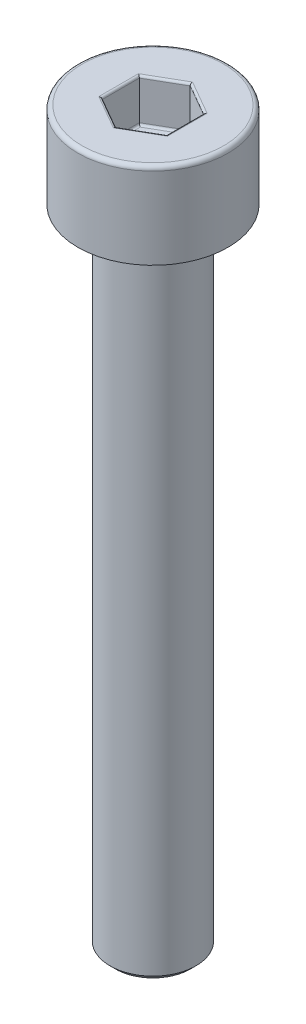
ISO-10303-21;
HEADER;
FILE_DESCRIPTION(('STEP AP214'),'2;1');
FILE_NAME('part.step','',(''),(''),'','','');
FILE_SCHEMA(('AUTOMOTIVE_DESIGN { 1 0 10303 214 1 1 1 1 }'));
ENDSEC;
DATA;
#1=APPLICATION_CONTEXT('core data for automotive mechanical design processes');
#2=APPLICATION_PROTOCOL_DEFINITION('international standard','automotive_design',2000,#1);
#3=PRODUCT_CONTEXT('',#1,'mechanical');
#4=PRODUCT('Part','Part','',(#3));
#5=PRODUCT_RELATED_PRODUCT_CATEGORY('part','',(#4));
#6=PRODUCT_DEFINITION_FORMATION('','',#4);
#7=PRODUCT_DEFINITION_CONTEXT('part definition',#1,'design');
#8=PRODUCT_DEFINITION('design','',#6,#7);
#9=PRODUCT_DEFINITION_SHAPE('','',#8);
#10=(LENGTH_UNIT() NAMED_UNIT(*) SI_UNIT(.MILLI.,.METRE.));
#11=(NAMED_UNIT(*) PLANE_ANGLE_UNIT() SI_UNIT($,.RADIAN.));
#12=(NAMED_UNIT(*) SI_UNIT($,.STERADIAN.) SOLID_ANGLE_UNIT());
#13=UNCERTAINTY_MEASURE_WITH_UNIT(LENGTH_MEASURE(1.E-05),#10,'distance_accuracy_value','');
#14=(GEOMETRIC_REPRESENTATION_CONTEXT(3) GLOBAL_UNCERTAINTY_ASSIGNED_CONTEXT((#13)) GLOBAL_UNIT_ASSIGNED_CONTEXT((#10,
#11,#12)) REPRESENTATION_CONTEXT('',''));
#15=CARTESIAN_POINT('',(0.,0.,0.));
#16=DIRECTION('',(0.,0.,1.));
#17=DIRECTION('',(1.,0.,0.));
#18=AXIS2_PLACEMENT_3D('',#15,#16,#17);
#19=CARTESIAN_POINT('',(0.,-34.,0.));
#20=DIRECTION('',(0.,-1.,0.));
#21=DIRECTION('',(0.,0.,-1.));
#22=AXIS2_PLACEMENT_3D('',#19,#20,#21);
#23=PLANE('',#22);
#24=CARTESIAN_POINT('',(0.,-34.,0.));
#25=DIRECTION('',(0.,-1.,0.));
#26=DIRECTION('',(0.,0.,-1.));
#27=AXIS2_PLACEMENT_3D('',#24,#25,#26);
#28=CIRCLE('',#27,1.74999999999999);
#29=CARTESIAN_POINT('',(0.,-34.,-1.74999999999999));
#30=VERTEX_POINT('',#29);
#31=EDGE_CURVE('E261',#30,#30,#28,.T.);
#32=ORIENTED_EDGE('',*,*,#31,.T.);
#33=EDGE_LOOP('',(#32));
#34=FACE_BOUND('',#33,.T.);
#35=ADVANCED_FACE('F33',(#34),#23,.T.);
#36=CARTESIAN_POINT('',(0.,0.,0.));
#37=DIRECTION('',(0.,1.,0.));
#38=DIRECTION('',(0.,0.,1.));
#39=AXIS2_PLACEMENT_3D('',#36,#37,#38);
#40=CYLINDRICAL_SURFACE('',#39,2.);
#41=CARTESIAN_POINT('',(0.,-4.25,0.));
#42=DIRECTION('',(0.,-1.,0.));
#43=DIRECTION('',(0.,0.,-1.));
#44=AXIS2_PLACEMENT_3D('',#41,#42,#43);
#45=CIRCLE('',#44,2.);
#46=CARTESIAN_POINT('',(0.,-4.25,-2.));
#47=VERTEX_POINT('',#46);
#48=EDGE_CURVE('E258',#47,#47,#45,.T.);
#49=ORIENTED_EDGE('',*,*,#48,.T.);
#50=EDGE_LOOP('',(#49));
#51=FACE_BOUND('',#50,.T.);
#52=CARTESIAN_POINT('',(0.,-33.75,0.));
#53=DIRECTION('',(0.,-1.,0.));
#54=DIRECTION('',(0.,0.,-1.));
#55=AXIS2_PLACEMENT_3D('',#52,#53,#54);
#56=CIRCLE('',#55,2.);
#57=CARTESIAN_POINT('',(0.,-33.75,-2.));
#58=VERTEX_POINT('',#57);
#59=EDGE_CURVE('E255',#58,#58,#56,.F.);
#60=ORIENTED_EDGE('',*,*,#59,.T.);
#61=EDGE_LOOP('',(#60));
#62=FACE_BOUND('',#61,.T.);
#63=ADVANCED_FACE('F287',(#51,#62),#40,.T.);
#64=CARTESIAN_POINT('',(-2.,-4.,0.));
#65=DIRECTION('',(0.,-1.,0.));
#66=DIRECTION('',(0.,0.,-1.));
#67=AXIS2_PLACEMENT_3D('',#64,#65,#66);
#68=PLANE('',#67);
#69=CARTESIAN_POINT('',(0.,-4.,0.));
#70=DIRECTION('',(0.,-1.,0.));
#71=DIRECTION('',(0.,0.,-1.));
#72=AXIS2_PLACEMENT_3D('',#69,#70,#71);
#73=CIRCLE('',#72,2.25);
#74=CARTESIAN_POINT('',(0.,-4.,-2.25));
#75=VERTEX_POINT('',#74);
#76=EDGE_CURVE('E252',#75,#75,#73,.F.);
#77=ORIENTED_EDGE('',*,*,#76,.T.);
#78=EDGE_LOOP('',(#77));
#79=FACE_BOUND('',#78,.T.);
#80=CARTESIAN_POINT('',(0.,-4.,0.));
#81=DIRECTION('',(0.,1.,0.));
#82=DIRECTION('',(0.,0.,1.));
#83=AXIS2_PLACEMENT_3D('',#80,#81,#82);
#84=CIRCLE('',#83,3.5);
#85=CARTESIAN_POINT('',(0.,-4.,3.5));
#86=VERTEX_POINT('',#85);
#87=EDGE_CURVE('E249',#86,#86,#84,.T.);
#88=ORIENTED_EDGE('',*,*,#87,.F.);
#89=EDGE_LOOP('',(#88));
#90=FACE_BOUND('',#89,.T.);
#91=ADVANCED_FACE('F293',(#79,#90),#68,.T.);
#92=CARTESIAN_POINT('',(0.,0.,0.));
#93=DIRECTION('',(0.,1.,0.));
#94=DIRECTION('',(0.,0.,1.));
#95=AXIS2_PLACEMENT_3D('',#92,#93,#94);
#96=CYLINDRICAL_SURFACE('',#95,3.5);
#97=CARTESIAN_POINT('',(0.,-0.2,0.));
#98=DIRECTION('',(0.,1.,0.));
#99=DIRECTION('',(0.,0.,1.));
#100=AXIS2_PLACEMENT_3D('',#97,#98,#99);
#101=CIRCLE('',#100,3.5);
#102=CARTESIAN_POINT('',(0.,-0.2,3.5));
#103=VERTEX_POINT('',#102);
#104=EDGE_CURVE('E159',#103,#103,#101,.F.);
#105=ORIENTED_EDGE('',*,*,#104,.T.);
#106=EDGE_LOOP('',(#105));
#107=FACE_BOUND('',#106,.T.);
#108=ORIENTED_EDGE('',*,*,#87,.T.);
#109=EDGE_LOOP('',(#108));
#110=FACE_BOUND('',#109,.T.);
#111=ADVANCED_FACE('F303',(#107,#110),#96,.T.);
#112=CARTESIAN_POINT('',(-3.5,0.,0.));
#113=DIRECTION('',(0.,1.,0.));
#114=DIRECTION('',(0.,0.,1.));
#115=AXIS2_PLACEMENT_3D('',#112,#113,#114);
#116=PLANE('',#115);
#117=DIRECTION('',(0.,0.,1.));
#118=VECTOR('',#117,1.);
#119=CARTESIAN_POINT('',(-1.6,0.,-0.86602540378444));
#120=LINE('',#119,#118);
#121=CARTESIAN_POINT('',(-1.6,0.,0.923760430703401));
#122=VERTEX_POINT('',#121);
#123=CARTESIAN_POINT('',(-1.6,0.,-0.923760430703403));
#124=VERTEX_POINT('',#123);
#125=EDGE_CURVE('E175',#122,#124,#120,.F.);
#126=ORIENTED_EDGE('',*,*,#125,.T.);
#127=DIRECTION('',(-0.866025403784439,0.,0.5));
#128=VECTOR('',#127,1.);
#129=CARTESIAN_POINT('',(-0.0499999999999999,0.,-1.81865334794732));
#130=LINE('',#129,#128);
#131=CARTESIAN_POINT('',(0.,0.,-1.8475208614068));
#132=VERTEX_POINT('',#131);
#133=EDGE_CURVE('E134',#124,#132,#130,.F.);
#134=ORIENTED_EDGE('',*,*,#133,.T.);
#135=DIRECTION('',(-0.866025403784439,0.,-0.5));
#136=VECTOR('',#135,1.);
#137=CARTESIAN_POINT('',(1.55,0.,-0.952627944162884));
#138=LINE('',#137,#136);
#139=CARTESIAN_POINT('',(1.6,0.,-0.923760430703403));
#140=VERTEX_POINT('',#139);
#141=EDGE_CURVE('E161',#132,#140,#138,.F.);
#142=ORIENTED_EDGE('',*,*,#141,.T.);
#143=DIRECTION('',(0.,0.,-1.));
#144=VECTOR('',#143,1.);
#145=CARTESIAN_POINT('',(1.6,0.,0.866025403784439));
#146=LINE('',#145,#144);
#147=CARTESIAN_POINT('',(1.6,0.,0.923760430703402));
#148=VERTEX_POINT('',#147);
#149=EDGE_CURVE('E169',#140,#148,#146,.F.);
#150=ORIENTED_EDGE('',*,*,#149,.T.);
#151=DIRECTION('',(0.866025403784439,0.,-0.5));
#152=VECTOR('',#151,1.);
#153=CARTESIAN_POINT('',(0.0499999999999988,0.,1.81865334794732));
#154=LINE('',#153,#152);
#155=CARTESIAN_POINT('',(0.,0.,1.8475208614068));
#156=VERTEX_POINT('',#155);
#157=EDGE_CURVE('E171',#148,#156,#154,.F.);
#158=ORIENTED_EDGE('',*,*,#157,.T.);
#159=DIRECTION('',(0.866025403784439,0.,0.5));
#160=VECTOR('',#159,1.);
#161=CARTESIAN_POINT('',(-1.55,0.,0.952627944162882));
#162=LINE('',#161,#160);
#163=EDGE_CURVE('E173',#156,#122,#162,.F.);
#164=ORIENTED_EDGE('',*,*,#163,.T.);
#165=EDGE_LOOP('',(#126,#134,#142,#150,#158,#164));
#166=FACE_BOUND('',#165,.T.);
#167=CARTESIAN_POINT('',(0.,0.,0.));
#168=DIRECTION('',(0.,1.,0.));
#169=DIRECTION('',(0.,0.,1.));
#170=AXIS2_PLACEMENT_3D('',#167,#168,#169);
#171=CIRCLE('',#170,3.3);
#172=CARTESIAN_POINT('',(0.,0.,3.3));
#173=VERTEX_POINT('',#172);
#174=EDGE_CURVE('E164',#173,#173,#171,.T.);
#175=ORIENTED_EDGE('',*,*,#174,.T.);
#176=EDGE_LOOP('',(#175));
#177=FACE_BOUND('',#176,.T.);
#178=ADVANCED_FACE('F266',(#166,#177),#116,.T.);
#179=CARTESIAN_POINT('',(0.,-4.,0.));
#180=DIRECTION('',(0.,1.,0.));
#181=DIRECTION('',(0.,0.,1.));
#182=AXIS2_PLACEMENT_3D('',#179,#180,#181);
#183=CONICAL_SURFACE('',#182,2.25,0.785398163397454);
#184=ORIENTED_EDGE('',*,*,#48,.F.);
#185=EDGE_LOOP('',(#184));
#186=FACE_BOUND('',#185,.T.);
#187=ORIENTED_EDGE('',*,*,#76,.F.);
#188=EDGE_LOOP('',(#187));
#189=FACE_BOUND('',#188,.T.);
#190=ADVANCED_FACE('F281',(#186,#189),#183,.T.);
#191=CARTESIAN_POINT('',(0.,-33.75,0.));
#192=DIRECTION('',(0.,1.,0.));
#193=DIRECTION('',(0.,0.,1.));
#194=AXIS2_PLACEMENT_3D('',#191,#192,#193);
#195=CONICAL_SURFACE('',#194,2.,0.785398163397449);
#196=ORIENTED_EDGE('',*,*,#31,.F.);
#197=EDGE_LOOP('',(#196));
#198=FACE_BOUND('',#197,.T.);
#199=ORIENTED_EDGE('',*,*,#59,.F.);
#200=EDGE_LOOP('',(#199));
#201=FACE_BOUND('',#200,.T.);
#202=ADVANCED_FACE('F271',(#198,#201),#195,.T.);
#203=CARTESIAN_POINT('',(0.,-0.2,0.));
#204=DIRECTION('',(0.,1.,0.));
#205=DIRECTION('',(0.,0.,1.));
#206=AXIS2_PLACEMENT_3D('',#203,#204,#205);
#207=TOROIDAL_SURFACE('',#206,3.3,0.2);
#208=ORIENTED_EDGE('',*,*,#104,.F.);
#209=EDGE_LOOP('',(#208));
#210=FACE_BOUND('',#209,.T.);
#211=ORIENTED_EDGE('',*,*,#174,.F.);
#212=EDGE_LOOP('',(#211));
#213=FACE_BOUND('',#212,.T.);
#214=ADVANCED_FACE('F268',(#210,#213),#207,.T.);
#215=CARTESIAN_POINT('',(1.5,-2.,-0.86602540378444));
#216=DIRECTION('',(0.5,0.,-0.866025403784439));
#217=DIRECTION('',(-0.866025403784439,0.,-0.5));
#218=AXIS2_PLACEMENT_3D('',#215,#216,#217);
#219=PLANE('',#218);
#220=DIRECTION('',(0.,1.,0.));
#221=VECTOR('',#220,1.);
#222=CARTESIAN_POINT('',(1.5,-2.,-0.86602540378444));
#223=LINE('',#222,#221);
#224=CARTESIAN_POINT('',(1.5,-1.9,-0.86602540378444));
#225=VERTEX_POINT('',#224);
#226=CARTESIAN_POINT('',(1.5,-0.1,-0.86602540378444));
#227=VERTEX_POINT('',#226);
#228=EDGE_CURVE('E243',#225,#227,#223,.T.);
#229=ORIENTED_EDGE('',*,*,#228,.T.);
#230=DIRECTION('',(-0.866025403784439,0.,-0.5));
#231=VECTOR('',#230,1.);
#232=CARTESIAN_POINT('',(0.,-0.1,-1.73205080756888));
#233=LINE('',#232,#231);
#234=CARTESIAN_POINT('',(0.,-0.1,-1.73205080756888));
#235=VERTEX_POINT('',#234);
#236=EDGE_CURVE('E195',#227,#235,#233,.T.);
#237=ORIENTED_EDGE('',*,*,#236,.T.);
#238=DIRECTION('',(0.,1.,0.));
#239=VECTOR('',#238,1.);
#240=CARTESIAN_POINT('',(0.,-2.,-1.73205080756888));
#241=LINE('',#240,#239);
#242=CARTESIAN_POINT('',(0.,-1.9,-1.73205080756888));
#243=VERTEX_POINT('',#242);
#244=EDGE_CURVE('E145',#243,#235,#241,.T.);
#245=ORIENTED_EDGE('',*,*,#244,.F.);
#246=DIRECTION('',(-0.866025403784439,0.,-0.5));
#247=VECTOR('',#246,1.);
#248=CARTESIAN_POINT('',(1.5,-1.9,-0.86602540378444));
#249=LINE('',#248,#247);
#250=EDGE_CURVE('E193',#243,#225,#249,.F.);
#251=ORIENTED_EDGE('',*,*,#250,.T.);
#252=EDGE_LOOP('',(#229,#237,#245,#251));
#253=FACE_BOUND('',#252,.T.);
#254=ADVANCED_FACE('F270',(#253),#219,.F.);
#255=CARTESIAN_POINT('',(1.5,-2.,0.866025403784439));
#256=DIRECTION('',(1.,0.,0.));
#257=DIRECTION('',(0.,0.,-1.));
#258=AXIS2_PLACEMENT_3D('',#255,#256,#257);
#259=PLANE('',#258);
#260=DIRECTION('',(0.,1.,0.));
#261=VECTOR('',#260,1.);
#262=CARTESIAN_POINT('',(1.5,-2.,0.866025403784439));
#263=LINE('',#262,#261);
#264=CARTESIAN_POINT('',(1.5,-1.9,0.866025403784439));
#265=VERTEX_POINT('',#264);
#266=CARTESIAN_POINT('',(1.5,-0.1,0.866025403784439));
#267=VERTEX_POINT('',#266);
#268=EDGE_CURVE('E240',#265,#267,#263,.T.);
#269=ORIENTED_EDGE('',*,*,#268,.T.);
#270=DIRECTION('',(0.,0.,-1.));
#271=VECTOR('',#270,1.);
#272=CARTESIAN_POINT('',(1.5,-0.1,-0.86602540378444));
#273=LINE('',#272,#271);
#274=EDGE_CURVE('E191',#267,#227,#273,.T.);
#275=ORIENTED_EDGE('',*,*,#274,.T.);
#276=ORIENTED_EDGE('',*,*,#228,.F.);
#277=DIRECTION('',(0.,0.,-1.));
#278=VECTOR('',#277,1.);
#279=CARTESIAN_POINT('',(1.5,-1.9,0.866025403784439));
#280=LINE('',#279,#278);
#281=EDGE_CURVE('E188',#225,#265,#280,.F.);
#282=ORIENTED_EDGE('',*,*,#281,.T.);
#283=EDGE_LOOP('',(#269,#275,#276,#282));
#284=FACE_BOUND('',#283,.T.);
#285=ADVANCED_FACE('F278',(#284),#259,.F.);
#286=CARTESIAN_POINT('',(0.,-2.,1.73205080756888));
#287=DIRECTION('',(0.5,0.,0.866025403784439));
#288=DIRECTION('',(0.866025403784439,0.,-0.5));
#289=AXIS2_PLACEMENT_3D('',#286,#287,#288);
#290=PLANE('',#289);
#291=DIRECTION('',(0.,1.,0.));
#292=VECTOR('',#291,1.);
#293=CARTESIAN_POINT('',(0.,-2.,1.73205080756888));
#294=LINE('',#293,#292);
#295=CARTESIAN_POINT('',(0.,-1.9,1.73205080756888));
#296=VERTEX_POINT('',#295);
#297=CARTESIAN_POINT('',(0.,-0.1,1.73205080756888));
#298=VERTEX_POINT('',#297);
#299=EDGE_CURVE('E237',#296,#298,#294,.T.);
#300=ORIENTED_EDGE('',*,*,#299,.T.);
#301=DIRECTION('',(0.866025403784439,0.,-0.5));
#302=VECTOR('',#301,1.);
#303=CARTESIAN_POINT('',(1.5,-0.1,0.866025403784439));
#304=LINE('',#303,#302);
#305=EDGE_CURVE('E186',#298,#267,#304,.T.);
#306=ORIENTED_EDGE('',*,*,#305,.T.);
#307=ORIENTED_EDGE('',*,*,#268,.F.);
#308=DIRECTION('',(0.866025403784439,0.,-0.5));
#309=VECTOR('',#308,1.);
#310=CARTESIAN_POINT('',(0.,-1.9,1.73205080756888));
#311=LINE('',#310,#309);
#312=EDGE_CURVE('E184',#265,#296,#311,.F.);
#313=ORIENTED_EDGE('',*,*,#312,.T.);
#314=EDGE_LOOP('',(#300,#306,#307,#313));
#315=FACE_BOUND('',#314,.T.);
#316=ADVANCED_FACE('F327',(#315),#290,.F.);
#317=CARTESIAN_POINT('',(-1.5,-2.,0.866025403784438));
#318=DIRECTION('',(-0.5,0.,0.866025403784439));
#319=DIRECTION('',(0.866025403784439,0.,0.5));
#320=AXIS2_PLACEMENT_3D('',#317,#318,#319);
#321=PLANE('',#320);
#322=DIRECTION('',(0.,1.,0.));
#323=VECTOR('',#322,1.);
#324=CARTESIAN_POINT('',(-1.5,-2.,0.866025403784438));
#325=LINE('',#324,#323);
#326=CARTESIAN_POINT('',(-1.5,-1.9,0.866025403784438));
#327=VERTEX_POINT('',#326);
#328=CARTESIAN_POINT('',(-1.5,-0.1,0.866025403784438));
#329=VERTEX_POINT('',#328);
#330=EDGE_CURVE('E128',#327,#329,#325,.T.);
#331=ORIENTED_EDGE('',*,*,#330,.T.);
#332=DIRECTION('',(0.866025403784439,0.,0.5));
#333=VECTOR('',#332,1.);
#334=CARTESIAN_POINT('',(0.,-0.1,1.73205080756888));
#335=LINE('',#334,#333);
#336=EDGE_CURVE('E182',#329,#298,#335,.T.);
#337=ORIENTED_EDGE('',*,*,#336,.T.);
#338=ORIENTED_EDGE('',*,*,#299,.F.);
#339=DIRECTION('',(0.866025403784439,0.,0.5));
#340=VECTOR('',#339,1.);
#341=CARTESIAN_POINT('',(-1.5,-1.9,0.866025403784438));
#342=LINE('',#341,#340);
#343=EDGE_CURVE('E180',#296,#327,#342,.F.);
#344=ORIENTED_EDGE('',*,*,#343,.T.);
#345=EDGE_LOOP('',(#331,#337,#338,#344));
#346=FACE_BOUND('',#345,.T.);
#347=ADVANCED_FACE('F234',(#346),#321,.F.);
#348=CARTESIAN_POINT('',(-1.5,-2.,-0.86602540378444));
#349=DIRECTION('',(-1.,0.,0.));
#350=DIRECTION('',(0.,0.,1.));
#351=AXIS2_PLACEMENT_3D('',#348,#349,#350);
#352=PLANE('',#351);
#353=DIRECTION('',(0.,1.,0.));
#354=VECTOR('',#353,1.);
#355=CARTESIAN_POINT('',(-1.5,-2.,-0.86602540378444));
#356=LINE('',#355,#354);
#357=CARTESIAN_POINT('',(-1.5,-1.9,-0.86602540378444));
#358=VERTEX_POINT('',#357);
#359=CARTESIAN_POINT('',(-1.5,-0.1,-0.86602540378444));
#360=VERTEX_POINT('',#359);
#361=EDGE_CURVE('E126',#358,#360,#356,.T.);
#362=ORIENTED_EDGE('',*,*,#361,.T.);
#363=DIRECTION('',(0.,0.,1.));
#364=VECTOR('',#363,1.);
#365=CARTESIAN_POINT('',(-1.5,-0.1,0.866025403784438));
#366=LINE('',#365,#364);
#367=EDGE_CURVE('E133',#360,#329,#366,.T.);
#368=ORIENTED_EDGE('',*,*,#367,.T.);
#369=ORIENTED_EDGE('',*,*,#330,.F.);
#370=DIRECTION('',(0.,0.,1.));
#371=VECTOR('',#370,1.);
#372=CARTESIAN_POINT('',(-1.5,-1.9,-0.86602540378444));
#373=LINE('',#372,#371);
#374=EDGE_CURVE('E123',#327,#358,#373,.F.);
#375=ORIENTED_EDGE('',*,*,#374,.T.);
#376=EDGE_LOOP('',(#362,#368,#369,#375));
#377=FACE_BOUND('',#376,.T.);
#378=ADVANCED_FACE('F125',(#377),#352,.F.);
#379=CARTESIAN_POINT('',(0.,-2.,-1.73205080756888));
#380=DIRECTION('',(-0.5,0.,-0.866025403784439));
#381=DIRECTION('',(-0.866025403784439,0.,0.5));
#382=AXIS2_PLACEMENT_3D('',#379,#380,#381);
#383=PLANE('',#382);
#384=ORIENTED_EDGE('',*,*,#244,.T.);
#385=DIRECTION('',(-0.866025403784439,0.,0.5));
#386=VECTOR('',#385,1.);
#387=CARTESIAN_POINT('',(-1.5,-0.1,-0.86602540378444));
#388=LINE('',#387,#386);
#389=EDGE_CURVE('E144',#235,#360,#388,.T.);
#390=ORIENTED_EDGE('',*,*,#389,.T.);
#391=ORIENTED_EDGE('',*,*,#361,.F.);
#392=DIRECTION('',(-0.866025403784439,0.,0.5));
#393=VECTOR('',#392,1.);
#394=CARTESIAN_POINT('',(0.,-1.9,-1.73205080756888));
#395=LINE('',#394,#393);
#396=EDGE_CURVE('E141',#358,#243,#395,.F.);
#397=ORIENTED_EDGE('',*,*,#396,.T.);
#398=EDGE_LOOP('',(#384,#390,#391,#397));
#399=FACE_BOUND('',#398,.T.);
#400=ADVANCED_FACE('F139',(#399),#383,.F.);
#401=CARTESIAN_POINT('',(1.5,-2.,-0.86602540378444));
#402=DIRECTION('',(0.,-1.,0.));
#403=DIRECTION('',(0.,0.,-1.));
#404=AXIS2_PLACEMENT_3D('',#401,#402,#403);
#405=PLANE('',#404);
#406=DIRECTION('',(0.866025403784439,0.,-0.5));
#407=VECTOR('',#406,1.);
#408=CARTESIAN_POINT('',(1.45,-2.,0.779422863405995));
#409=LINE('',#408,#407);
#410=CARTESIAN_POINT('',(0.,-2.,1.61658075373095));
#411=VERTEX_POINT('',#410);
#412=CARTESIAN_POINT('',(1.4,-2.,0.808290376865476));
#413=VERTEX_POINT('',#412);
#414=EDGE_CURVE('E42',#411,#413,#409,.T.);
#415=ORIENTED_EDGE('',*,*,#414,.T.);
#416=DIRECTION('',(0.,0.,-1.));
#417=VECTOR('',#416,1.);
#418=CARTESIAN_POINT('',(1.4,-2.,-0.86602540378444));
#419=LINE('',#418,#417);
#420=CARTESIAN_POINT('',(1.4,-2.,-0.808290376865478));
#421=VERTEX_POINT('',#420);
#422=EDGE_CURVE('E11',#413,#421,#419,.T.);
#423=ORIENTED_EDGE('',*,*,#422,.T.);
#424=DIRECTION('',(-0.866025403784439,0.,-0.5));
#425=VECTOR('',#424,1.);
#426=CARTESIAN_POINT('',(-0.0500000000000001,-2.,-1.64544826719043));
#427=LINE('',#426,#425);
#428=CARTESIAN_POINT('',(0.,-2.,-1.61658075373095));
#429=VERTEX_POINT('',#428);
#430=EDGE_CURVE('E197',#421,#429,#427,.T.);
#431=ORIENTED_EDGE('',*,*,#430,.T.);
#432=DIRECTION('',(-0.866025403784439,0.,0.5));
#433=VECTOR('',#432,1.);
#434=CARTESIAN_POINT('',(-1.45,-2.,-0.779422863405997));
#435=LINE('',#434,#433);
#436=CARTESIAN_POINT('',(-1.4,-2.,-0.808290376865478));
#437=VERTEX_POINT('',#436);
#438=EDGE_CURVE('E199',#429,#437,#435,.T.);
#439=ORIENTED_EDGE('',*,*,#438,.T.);
#440=DIRECTION('',(0.,0.,1.));
#441=VECTOR('',#440,1.);
#442=CARTESIAN_POINT('',(-1.4,-2.,0.866025403784438));
#443=LINE('',#442,#441);
#444=CARTESIAN_POINT('',(-1.4,-2.,0.808290376865476));
#445=VERTEX_POINT('',#444);
#446=EDGE_CURVE('E150',#437,#445,#443,.T.);
#447=ORIENTED_EDGE('',*,*,#446,.T.);
#448=DIRECTION('',(0.866025403784439,0.,0.5));
#449=VECTOR('',#448,1.);
#450=CARTESIAN_POINT('',(0.0499999999999989,-2.,1.64544826719043));
#451=LINE('',#450,#449);
#452=EDGE_CURVE('E53',#445,#411,#451,.T.);
#453=ORIENTED_EDGE('',*,*,#452,.T.);
#454=EDGE_LOOP('',(#415,#423,#431,#439,#447,#453));
#455=FACE_BOUND('',#454,.T.);
#456=ADVANCED_FACE('F322',(#455),#405,.F.);
#457=CARTESIAN_POINT('',(0.0499999999999988,-0.1,1.81865334794732));
#458=DIRECTION('',(-0.866025403784439,0.,0.5));
#459=DIRECTION('',(0.5,0.,0.866025403784439));
#460=AXIS2_PLACEMENT_3D('',#457,#458,#459);
#461=CYLINDRICAL_SURFACE('',#460,0.1);
#462=CARTESIAN_POINT('',(0.,-0.1,1.8475208614068));
#463=DIRECTION('',(-1.,0.,0.));
#464=DIRECTION('',(0.,0.,-1.));
#465=AXIS2_PLACEMENT_3D('',#462,#463,#464);
#466=ELLIPSE('',#465,0.115470053837925,0.1);
#467=EDGE_CURVE('E214',#156,#298,#466,.T.);
#468=ORIENTED_EDGE('',*,*,#467,.F.);
#469=ORIENTED_EDGE('',*,*,#157,.F.);
#470=CARTESIAN_POINT('',(1.6,-0.1,0.923760430703402));
#471=DIRECTION('',(-0.5,0.,0.866025403784439));
#472=DIRECTION('',(-0.866025403784439,0.,-0.5));
#473=AXIS2_PLACEMENT_3D('',#470,#471,#472);
#474=ELLIPSE('',#473,0.115470053837925,0.1);
#475=EDGE_CURVE('E217',#267,#148,#474,.F.);
#476=ORIENTED_EDGE('',*,*,#475,.F.);
#477=ORIENTED_EDGE('',*,*,#305,.F.);
#478=EDGE_LOOP('',(#468,#469,#476,#477));
#479=FACE_BOUND('',#478,.T.);
#480=ADVANCED_FACE('F334',(#479),#461,.T.);
#481=CARTESIAN_POINT('',(1.6,-0.1,0.866025403784439));
#482=DIRECTION('',(0.,0.,1.));
#483=DIRECTION('',(1.,0.,0.));
#484=AXIS2_PLACEMENT_3D('',#481,#482,#483);
#485=CYLINDRICAL_SURFACE('',#484,0.1);
#486=ORIENTED_EDGE('',*,*,#475,.T.);
#487=ORIENTED_EDGE('',*,*,#149,.F.);
#488=CARTESIAN_POINT('',(1.6,-0.1,-0.923760430703402));
#489=DIRECTION('',(0.5,0.,0.866025403784439));
#490=DIRECTION('',(-0.866025403784439,0.,0.5));
#491=AXIS2_PLACEMENT_3D('',#488,#489,#490);
#492=ELLIPSE('',#491,0.115470053837925,0.1);
#493=EDGE_CURVE('E211',#227,#140,#492,.F.);
#494=ORIENTED_EDGE('',*,*,#493,.F.);
#495=ORIENTED_EDGE('',*,*,#274,.F.);
#496=EDGE_LOOP('',(#486,#487,#494,#495));
#497=FACE_BOUND('',#496,.T.);
#498=ADVANCED_FACE('F338',(#497),#485,.T.);
#499=CARTESIAN_POINT('',(-1.55,-0.1,0.952627944162882));
#500=DIRECTION('',(-0.866025403784439,0.,-0.5));
#501=DIRECTION('',(-0.5,0.,0.866025403784439));
#502=AXIS2_PLACEMENT_3D('',#499,#500,#501);
#503=CYLINDRICAL_SURFACE('',#502,0.1);
#504=ORIENTED_EDGE('',*,*,#467,.T.);
#505=ORIENTED_EDGE('',*,*,#336,.F.);
#506=CARTESIAN_POINT('',(-1.6,-0.1,0.923760430703401));
#507=DIRECTION('',(-0.5,0.,-0.866025403784439));
#508=DIRECTION('',(0.866025403784439,0.,-0.5));
#509=AXIS2_PLACEMENT_3D('',#506,#507,#508);
#510=ELLIPSE('',#509,0.115470053837925,0.1);
#511=EDGE_CURVE('E208',#122,#329,#510,.T.);
#512=ORIENTED_EDGE('',*,*,#511,.F.);
#513=ORIENTED_EDGE('',*,*,#163,.F.);
#514=EDGE_LOOP('',(#504,#505,#512,#513));
#515=FACE_BOUND('',#514,.T.);
#516=ADVANCED_FACE('F344',(#515),#503,.T.);
#517=CARTESIAN_POINT('',(1.55,-0.1,-0.952627944162884));
#518=DIRECTION('',(0.866025403784439,0.,0.5));
#519=DIRECTION('',(0.5,0.,-0.866025403784439));
#520=AXIS2_PLACEMENT_3D('',#517,#518,#519);
#521=CYLINDRICAL_SURFACE('',#520,0.1);
#522=ORIENTED_EDGE('',*,*,#493,.T.);
#523=ORIENTED_EDGE('',*,*,#141,.F.);
#524=CARTESIAN_POINT('',(0.,-0.1,-1.8475208614068));
#525=DIRECTION('',(1.,0.,0.));
#526=DIRECTION('',(0.,0.,-1.));
#527=AXIS2_PLACEMENT_3D('',#524,#525,#526);
#528=ELLIPSE('',#527,0.115470053837925,0.1);
#529=EDGE_CURVE('E206',#235,#132,#528,.F.);
#530=ORIENTED_EDGE('',*,*,#529,.F.);
#531=ORIENTED_EDGE('',*,*,#236,.F.);
#532=EDGE_LOOP('',(#522,#523,#530,#531));
#533=FACE_BOUND('',#532,.T.);
#534=ADVANCED_FACE('F374',(#533),#521,.T.);
#535=CARTESIAN_POINT('',(-1.6,-0.1,-0.86602540378444));
#536=DIRECTION('',(0.,0.,-1.));
#537=DIRECTION('',(-1.,0.,0.));
#538=AXIS2_PLACEMENT_3D('',#535,#536,#537);
#539=CYLINDRICAL_SURFACE('',#538,0.1);
#540=ORIENTED_EDGE('',*,*,#511,.T.);
#541=ORIENTED_EDGE('',*,*,#367,.F.);
#542=CARTESIAN_POINT('',(-1.6,-0.1,-0.923760430703403));
#543=DIRECTION('',(0.5,0.,-0.866025403784439));
#544=DIRECTION('',(0.866025403784439,0.,0.5));
#545=AXIS2_PLACEMENT_3D('',#542,#543,#544);
#546=ELLIPSE('',#545,0.115470053837925,0.1);
#547=EDGE_CURVE('E204',#124,#360,#546,.T.);
#548=ORIENTED_EDGE('',*,*,#547,.F.);
#549=ORIENTED_EDGE('',*,*,#125,.F.);
#550=EDGE_LOOP('',(#540,#541,#548,#549));
#551=FACE_BOUND('',#550,.T.);
#552=ADVANCED_FACE('F369',(#551),#539,.T.);
#553=CARTESIAN_POINT('',(-0.05,-0.1,-1.81865334794732));
#554=DIRECTION('',(0.866025403784439,0.,-0.5));
#555=DIRECTION('',(-0.5,0.,-0.866025403784439));
#556=AXIS2_PLACEMENT_3D('',#553,#554,#555);
#557=CYLINDRICAL_SURFACE('',#556,0.1);
#558=ORIENTED_EDGE('',*,*,#529,.T.);
#559=ORIENTED_EDGE('',*,*,#133,.F.);
#560=ORIENTED_EDGE('',*,*,#547,.T.);
#561=ORIENTED_EDGE('',*,*,#389,.F.);
#562=EDGE_LOOP('',(#558,#559,#560,#561));
#563=FACE_BOUND('',#562,.T.);
#564=ADVANCED_FACE('F365',(#563),#557,.T.);
#565=CARTESIAN_POINT('',(-1.4,-1.9,-0.86602540378444));
#566=DIRECTION('',(0.,0.,-1.));
#567=DIRECTION('',(-1.,0.,0.));
#568=AXIS2_PLACEMENT_3D('',#565,#566,#567);
#569=CYLINDRICAL_SURFACE('',#568,0.1);
#570=CARTESIAN_POINT('',(-1.4,-1.9,-0.808290376865478));
#571=DIRECTION('',(0.5,0.,-0.866025403784439));
#572=DIRECTION('',(-0.866025403784439,0.,-0.5));
#573=AXIS2_PLACEMENT_3D('',#570,#571,#572);
#574=ELLIPSE('',#573,0.115470053837925,0.1);
#575=EDGE_CURVE('E149',#358,#437,#574,.F.);
#576=ORIENTED_EDGE('',*,*,#575,.F.);
#577=ORIENTED_EDGE('',*,*,#374,.F.);
#578=CARTESIAN_POINT('',(-1.4,-1.9,0.808290376865476));
#579=DIRECTION('',(-0.5,0.,-0.866025403784439));
#580=DIRECTION('',(-0.866025403784439,0.,0.5));
#581=AXIS2_PLACEMENT_3D('',#578,#579,#580);
#582=ELLIPSE('',#581,0.115470053837925,0.1);
#583=EDGE_CURVE('E37',#445,#327,#582,.T.);
#584=ORIENTED_EDGE('',*,*,#583,.F.);
#585=ORIENTED_EDGE('',*,*,#446,.F.);
#586=EDGE_LOOP('',(#576,#577,#584,#585));
#587=FACE_BOUND('',#586,.T.);
#588=ADVANCED_FACE('F35',(#587),#569,.F.);
#589=CARTESIAN_POINT('',(0.0499999999999984,-1.9,1.64544826719043));
#590=DIRECTION('',(-0.866025403784439,0.,-0.5));
#591=DIRECTION('',(-0.5,0.,0.866025403784439));
#592=AXIS2_PLACEMENT_3D('',#589,#590,#591);
#593=CYLINDRICAL_SURFACE('',#592,0.1);
#594=ORIENTED_EDGE('',*,*,#583,.T.);
#595=ORIENTED_EDGE('',*,*,#343,.F.);
#596=CARTESIAN_POINT('',(0.,-1.9,1.61658075373095));
#597=DIRECTION('',(-1.,0.,0.));
#598=DIRECTION('',(0.,0.,1.));
#599=AXIS2_PLACEMENT_3D('',#596,#597,#598);
#600=ELLIPSE('',#599,0.115470053837925,0.1);
#601=EDGE_CURVE('E153',#411,#296,#600,.T.);
#602=ORIENTED_EDGE('',*,*,#601,.F.);
#603=ORIENTED_EDGE('',*,*,#452,.F.);
#604=EDGE_LOOP('',(#594,#595,#602,#603));
#605=FACE_BOUND('',#604,.T.);
#606=ADVANCED_FACE('F231',(#605),#593,.F.);
#607=CARTESIAN_POINT('',(0.8,-1.9,-2.07846096908265));
#608=DIRECTION('',(0.866025403784439,0.,-0.5));
#609=DIRECTION('',(-0.5,0.,-0.866025403784439));
#610=AXIS2_PLACEMENT_3D('',#607,#608,#609);
#611=CYLINDRICAL_SURFACE('',#610,0.1);
#612=ORIENTED_EDGE('',*,*,#575,.T.);
#613=ORIENTED_EDGE('',*,*,#438,.F.);
#614=CARTESIAN_POINT('',(0.,-1.9,-1.61658075373095));
#615=DIRECTION('',(1.,0.,0.));
#616=DIRECTION('',(0.,0.,-1.));
#617=AXIS2_PLACEMENT_3D('',#614,#615,#616);
#618=ELLIPSE('',#617,0.115470053837925,0.1);
#619=EDGE_CURVE('E157',#243,#429,#618,.F.);
#620=ORIENTED_EDGE('',*,*,#619,.F.);
#621=ORIENTED_EDGE('',*,*,#396,.F.);
#622=EDGE_LOOP('',(#612,#613,#620,#621));
#623=FACE_BOUND('',#622,.T.);
#624=ADVANCED_FACE('F155',(#623),#611,.F.);
#625=CARTESIAN_POINT('',(2.2,-1.9,0.346410161513775));
#626=DIRECTION('',(-0.866025403784439,0.,0.5));
#627=DIRECTION('',(0.5,0.,0.866025403784439));
#628=AXIS2_PLACEMENT_3D('',#625,#626,#627);
#629=CYLINDRICAL_SURFACE('',#628,0.1);
#630=ORIENTED_EDGE('',*,*,#601,.T.);
#631=ORIENTED_EDGE('',*,*,#312,.F.);
#632=CARTESIAN_POINT('',(1.4,-1.9,0.808290376865476));
#633=DIRECTION('',(-0.5,0.,0.866025403784439));
#634=DIRECTION('',(0.866025403784439,0.,0.5));
#635=AXIS2_PLACEMENT_3D('',#632,#633,#634);
#636=ELLIPSE('',#635,0.115470053837925,0.1);
#637=EDGE_CURVE('E222',#413,#265,#636,.T.);
#638=ORIENTED_EDGE('',*,*,#637,.F.);
#639=ORIENTED_EDGE('',*,*,#414,.F.);
#640=EDGE_LOOP('',(#630,#631,#638,#639));
#641=FACE_BOUND('',#640,.T.);
#642=ADVANCED_FACE('F228',(#641),#629,.F.);
#643=CARTESIAN_POINT('',(1.45,-1.9,-0.779422863405997));
#644=DIRECTION('',(0.866025403784439,0.,0.5));
#645=DIRECTION('',(0.5,0.,-0.866025403784439));
#646=AXIS2_PLACEMENT_3D('',#643,#644,#645);
#647=CYLINDRICAL_SURFACE('',#646,0.1);
#648=ORIENTED_EDGE('',*,*,#619,.T.);
#649=ORIENTED_EDGE('',*,*,#430,.F.);
#650=CARTESIAN_POINT('',(1.4,-1.9,-0.808290376865478));
#651=DIRECTION('',(0.5,0.,0.866025403784439));
#652=DIRECTION('',(-0.866025403784439,0.,0.5));
#653=AXIS2_PLACEMENT_3D('',#650,#651,#652);
#654=ELLIPSE('',#653,0.115470053837925,0.1);
#655=EDGE_CURVE('E220',#225,#421,#654,.F.);
#656=ORIENTED_EDGE('',*,*,#655,.F.);
#657=ORIENTED_EDGE('',*,*,#250,.F.);
#658=EDGE_LOOP('',(#648,#649,#656,#657));
#659=FACE_BOUND('',#658,.T.);
#660=ADVANCED_FACE('F353',(#659),#647,.F.);
#661=CARTESIAN_POINT('',(1.4,-1.9,-0.86602540378444));
#662=DIRECTION('',(0.,0.,1.));
#663=DIRECTION('',(1.,0.,0.));
#664=AXIS2_PLACEMENT_3D('',#661,#662,#663);
#665=CYLINDRICAL_SURFACE('',#664,0.1);
#666=ORIENTED_EDGE('',*,*,#637,.T.);
#667=ORIENTED_EDGE('',*,*,#281,.F.);
#668=ORIENTED_EDGE('',*,*,#655,.T.);
#669=ORIENTED_EDGE('',*,*,#422,.F.);
#670=EDGE_LOOP('',(#666,#667,#668,#669));
#671=FACE_BOUND('',#670,.T.);
#672=ADVANCED_FACE('F350',(#671),#665,.F.);
#673=CLOSED_SHELL('',(#35,#63,#91,#111,#178,#190,#202,#214,#254,#285,#316,#347,#378,#400,#456,
#480,#498,#516,#534,#552,#564,#588,#606,#624,#642,#660,#672));
#674=MANIFOLD_SOLID_BREP('B2',#673);
#675=ADVANCED_BREP_SHAPE_REPRESENTATION('',(#18,#674),#14);
#676=SHAPE_DEFINITION_REPRESENTATION(#9,#675);
ENDSEC;
END-ISO-10303-21;
